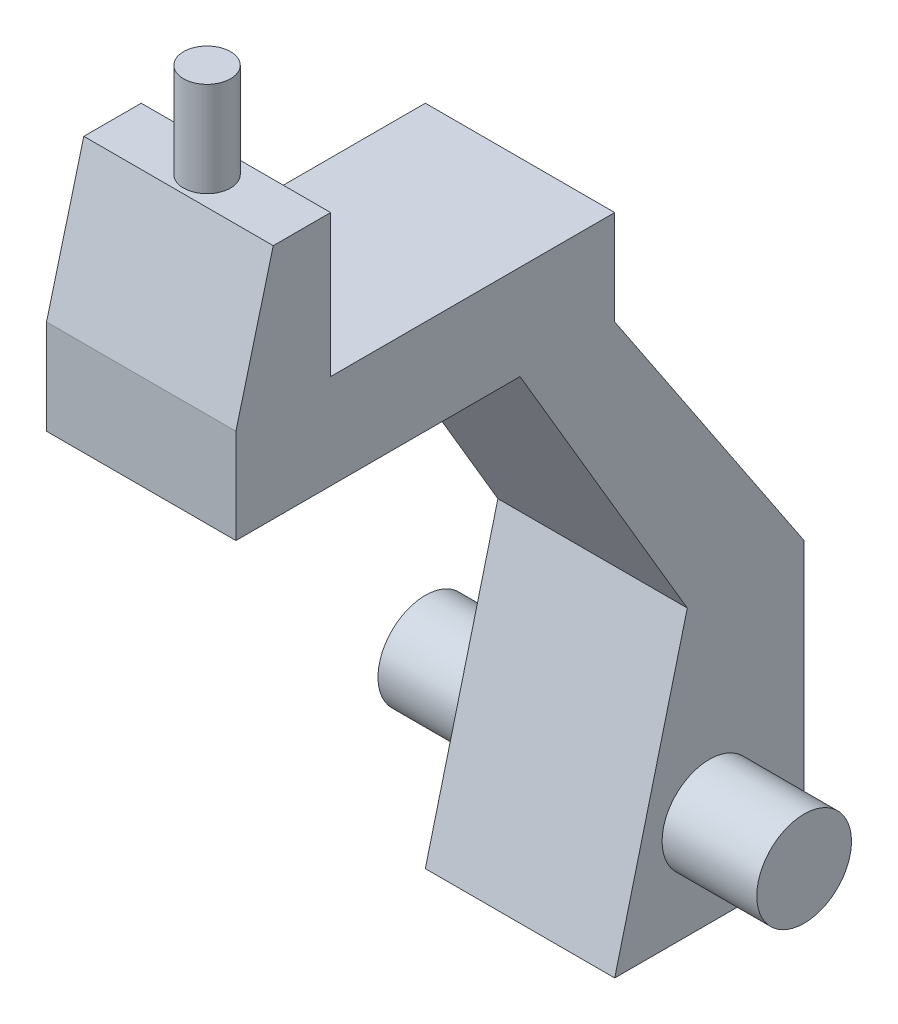
ISO-10303-21;
HEADER;
FILE_DESCRIPTION(('STEP AP214'),'2;1');
FILE_NAME('part.step','',(''),(''),'','','');
FILE_SCHEMA(('AUTOMOTIVE_DESIGN { 1 0 10303 214 1 1 1 1 }'));
ENDSEC;
DATA;
#1=APPLICATION_CONTEXT('core data for automotive mechanical design processes');
#2=APPLICATION_PROTOCOL_DEFINITION('international standard','automotive_design',2000,#1);
#3=PRODUCT_CONTEXT('',#1,'mechanical');
#4=PRODUCT('Part','Part','',(#3));
#5=PRODUCT_RELATED_PRODUCT_CATEGORY('part','',(#4));
#6=PRODUCT_DEFINITION_FORMATION('','',#4);
#7=PRODUCT_DEFINITION_CONTEXT('part definition',#1,'design');
#8=PRODUCT_DEFINITION('design','',#6,#7);
#9=PRODUCT_DEFINITION_SHAPE('','',#8);
#10=(LENGTH_UNIT() NAMED_UNIT(*) SI_UNIT(.MILLI.,.METRE.));
#11=(NAMED_UNIT(*) PLANE_ANGLE_UNIT() SI_UNIT($,.RADIAN.));
#12=(NAMED_UNIT(*) SI_UNIT($,.STERADIAN.) SOLID_ANGLE_UNIT());
#13=UNCERTAINTY_MEASURE_WITH_UNIT(LENGTH_MEASURE(1.E-05),#10,'distance_accuracy_value','');
#14=(GEOMETRIC_REPRESENTATION_CONTEXT(3) GLOBAL_UNCERTAINTY_ASSIGNED_CONTEXT((#13)) GLOBAL_UNIT_ASSIGNED_CONTEXT((#10,
#11,#12)) REPRESENTATION_CONTEXT('',''));
#15=CARTESIAN_POINT('',(0.,0.,0.));
#16=DIRECTION('',(0.,0.,1.));
#17=DIRECTION('',(1.,0.,0.));
#18=AXIS2_PLACEMENT_3D('',#15,#16,#17);
#19=CARTESIAN_POINT('',(-8.11188811188812,30.,-8.46153846153846));
#20=DIRECTION('',(1.,0.,0.));
#21=DIRECTION('',(0.,0.,-1.));
#22=AXIS2_PLACEMENT_3D('',#19,#20,#21);
#23=PLANE('',#22);
#24=CARTESIAN_POINT('',(-8.11188811188812,10.,1.53846153846154));
#25=DIRECTION('',(1.,0.,0.));
#26=DIRECTION('',(0.,0.,-1.));
#27=AXIS2_PLACEMENT_3D('',#24,#25,#26);
#28=CIRCLE('',#27,5.);
#29=CARTESIAN_POINT('',(-8.11188811188812,10.,-3.46153846153846));
#30=VERTEX_POINT('',#29);
#31=EDGE_CURVE('E177',#30,#30,#28,.T.);
#32=ORIENTED_EDGE('',*,*,#31,.T.);
#33=EDGE_LOOP('',(#32));
#34=FACE_BOUND('',#33,.T.);
#35=DIRECTION('',(0.,-1.,0.));
#36=VECTOR('',#35,1.);
#37=CARTESIAN_POINT('',(-8.11188811188811,70.,51.5384615384615));
#38=LINE('',#37,#36);
#39=CARTESIAN_POINT('',(-8.11188811188812,70.,51.5384615384615));
#40=VERTEX_POINT('',#39);
#41=CARTESIAN_POINT('',(-8.11188811188811,60.,51.5384615384615));
#42=VERTEX_POINT('',#41);
#43=EDGE_CURVE('E139',#40,#42,#38,.T.);
#44=ORIENTED_EDGE('',*,*,#43,.F.);
#45=DIRECTION('',(0.,0.967192592501153,-0.25404426584928));
#46=VECTOR('',#45,1.);
#47=CARTESIAN_POINT('',(-8.11188811188812,70.,51.5384615384615));
#48=LINE('',#47,#46);
#49=CARTESIAN_POINT('',(-8.11188811188812,85.,47.5985389033172));
#50=VERTEX_POINT('',#49);
#51=EDGE_CURVE('E125',#40,#50,#48,.T.);
#52=ORIENTED_EDGE('',*,*,#51,.T.);
#53=DIRECTION('',(0.,0.,1.));
#54=VECTOR('',#53,1.);
#55=CARTESIAN_POINT('',(-8.11188811188811,85.,51.5384615384615));
#56=LINE('',#55,#54);
#57=CARTESIAN_POINT('',(-8.11188811188811,85.,41.5384615384615));
#58=VERTEX_POINT('',#57);
#59=EDGE_CURVE('E218',#58,#50,#56,.T.);
#60=ORIENTED_EDGE('',*,*,#59,.F.);
#61=DIRECTION('',(0.,-1.,0.));
#62=VECTOR('',#61,1.);
#63=CARTESIAN_POINT('',(-8.11188811188811,85.,41.5384615384615));
#64=LINE('',#63,#62);
#65=CARTESIAN_POINT('',(-8.11188811188811,70.,41.5384615384615));
#66=VERTEX_POINT('',#65);
#67=EDGE_CURVE('E220',#58,#66,#64,.T.);
#68=ORIENTED_EDGE('',*,*,#67,.T.);
#69=DIRECTION('',(0.,0.,1.));
#70=VECTOR('',#69,1.);
#71=CARTESIAN_POINT('',(-8.11188811188812,70.,11.5384615384615));
#72=LINE('',#71,#70);
#73=CARTESIAN_POINT('',(-8.11188811188812,70.,11.5384615384615));
#74=VERTEX_POINT('',#73);
#75=EDGE_CURVE('E228',#74,#66,#72,.T.);
#76=ORIENTED_EDGE('',*,*,#75,.F.);
#77=DIRECTION('',(0.,-1.,0.));
#78=VECTOR('',#77,1.);
#79=CARTESIAN_POINT('',(-8.11188811188812,70.,11.5384615384615));
#80=LINE('',#79,#78);
#81=CARTESIAN_POINT('',(-8.11188811188812,60.,11.5384615384615));
#82=VERTEX_POINT('',#81);
#83=EDGE_CURVE('E235',#74,#82,#80,.T.);
#84=ORIENTED_EDGE('',*,*,#83,.T.);
#85=DIRECTION('',(0.,-0.832050294337844,-0.554700196225229));
#86=VECTOR('',#85,1.);
#87=CARTESIAN_POINT('',(-8.11188811188812,60.,11.5384615384615));
#88=LINE('',#87,#86);
#89=CARTESIAN_POINT('',(-8.11188811188812,30.,-8.46153846153846));
#90=VERTEX_POINT('',#89);
#91=EDGE_CURVE('E149',#82,#90,#88,.T.);
#92=ORIENTED_EDGE('',*,*,#91,.T.);
#93=DIRECTION('',(0.,-1.,0.));
#94=VECTOR('',#93,1.);
#95=CARTESIAN_POINT('',(-8.11188811188812,30.,-8.46153846153846));
#96=LINE('',#95,#94);
#97=CARTESIAN_POINT('',(-8.11188811188812,0.,-8.46153846153846));
#98=VERTEX_POINT('',#97);
#99=EDGE_CURVE('E197',#90,#98,#96,.T.);
#100=ORIENTED_EDGE('',*,*,#99,.T.);
#101=DIRECTION('',(0.,0.,1.));
#102=VECTOR('',#101,1.);
#103=CARTESIAN_POINT('',(-8.11188811188812,0.,-8.46153846153846));
#104=LINE('',#103,#102);
#105=CARTESIAN_POINT('',(-8.11188811188812,0.,11.5384615384615));
#106=VERTEX_POINT('',#105);
#107=EDGE_CURVE('E186',#98,#106,#104,.T.);
#108=ORIENTED_EDGE('',*,*,#107,.T.);
#109=DIRECTION('',(0.,0.968893399844212,-0.247478442977007));
#110=VECTOR('',#109,1.);
#111=CARTESIAN_POINT('',(-8.11188811188812,0.,11.5384615384615));
#112=LINE('',#111,#110);
#113=CARTESIAN_POINT('',(-8.11188811188812,30.,3.87574725998263));
#114=VERTEX_POINT('',#113);
#115=EDGE_CURVE('E170',#106,#114,#112,.T.);
#116=ORIENTED_EDGE('',*,*,#115,.T.);
#117=DIRECTION('',(0.,0.861737624952623,0.507354181751773));
#118=VECTOR('',#117,1.);
#119=CARTESIAN_POINT('',(-8.11188811188812,30.,3.87574725998263));
#120=LINE('',#119,#118);
#121=CARTESIAN_POINT('',(-8.11188811188812,60.,21.5384615384615));
#122=VERTEX_POINT('',#121);
#123=EDGE_CURVE('E163',#114,#122,#120,.T.);
#124=ORIENTED_EDGE('',*,*,#123,.T.);
#125=DIRECTION('',(0.,0.,1.));
#126=VECTOR('',#125,1.);
#127=CARTESIAN_POINT('',(-8.11188811188812,60.,11.5384615384615));
#128=LINE('',#127,#126);
#129=EDGE_CURVE('E145',#122,#42,#128,.T.);
#130=ORIENTED_EDGE('',*,*,#129,.T.);
#131=EDGE_LOOP('',(#44,#52,#60,#68,#76,#84,#92,#100,#108,#116,#124,#130));
#132=FACE_BOUND('',#131,.T.);
#133=ADVANCED_FACE('F38',(#34,#132),#23,.F.);
#134=CARTESIAN_POINT('',(11.8881118881119,30.,-8.46153846153846));
#135=DIRECTION('',(-1.,0.,0.));
#136=DIRECTION('',(0.,0.,1.));
#137=AXIS2_PLACEMENT_3D('',#134,#135,#136);
#138=PLANE('',#137);
#139=CARTESIAN_POINT('',(11.8881118881119,10.,1.53846153846154));
#140=DIRECTION('',(-1.,0.,0.));
#141=DIRECTION('',(0.,0.,1.));
#142=AXIS2_PLACEMENT_3D('',#139,#140,#141);
#143=CIRCLE('',#142,5.);
#144=CARTESIAN_POINT('',(11.8881118881119,10.,6.53846153846154));
#145=VERTEX_POINT('',#144);
#146=EDGE_CURVE('E41',#145,#145,#143,.F.);
#147=ORIENTED_EDGE('',*,*,#146,.F.);
#148=EDGE_LOOP('',(#147));
#149=FACE_BOUND('',#148,.T.);
#150=DIRECTION('',(0.,0.,-1.));
#151=VECTOR('',#150,1.);
#152=CARTESIAN_POINT('',(11.8881118881119,85.,51.5384615384615));
#153=LINE('',#152,#151);
#154=CARTESIAN_POINT('',(11.8881118881119,85.,47.5985389033172));
#155=VERTEX_POINT('',#154);
#156=CARTESIAN_POINT('',(11.8881118881119,85.,41.5384615384615));
#157=VERTEX_POINT('',#156);
#158=EDGE_CURVE('E212',#155,#157,#153,.T.);
#159=ORIENTED_EDGE('',*,*,#158,.F.);
#160=DIRECTION('',(0.,0.967192592501153,-0.25404426584928));
#161=VECTOR('',#160,1.);
#162=CARTESIAN_POINT('',(11.8881118881119,70.,51.5384615384615));
#163=LINE('',#162,#161);
#164=CARTESIAN_POINT('',(11.8881118881119,70.,51.5384615384615));
#165=VERTEX_POINT('',#164);
#166=EDGE_CURVE('E53',#165,#155,#163,.T.);
#167=ORIENTED_EDGE('',*,*,#166,.F.);
#168=DIRECTION('',(0.,-1.,0.));
#169=VECTOR('',#168,1.);
#170=CARTESIAN_POINT('',(11.8881118881119,70.,51.5384615384615));
#171=LINE('',#170,#169);
#172=CARTESIAN_POINT('',(11.8881118881119,60.,51.5384615384615));
#173=VERTEX_POINT('',#172);
#174=EDGE_CURVE('E141',#165,#173,#171,.T.);
#175=ORIENTED_EDGE('',*,*,#174,.T.);
#176=DIRECTION('',(0.,0.,-1.));
#177=VECTOR('',#176,1.);
#178=CARTESIAN_POINT('',(11.8881118881119,60.,11.5384615384615));
#179=LINE('',#178,#177);
#180=CARTESIAN_POINT('',(11.8881118881119,60.,21.5384615384615));
#181=VERTEX_POINT('',#180);
#182=EDGE_CURVE('E231',#173,#181,#179,.T.);
#183=ORIENTED_EDGE('',*,*,#182,.T.);
#184=DIRECTION('',(0.,0.861737624952623,0.507354181751773));
#185=VECTOR('',#184,1.);
#186=CARTESIAN_POINT('',(11.8881118881119,30.,3.87574725998263));
#187=LINE('',#186,#185);
#188=CARTESIAN_POINT('',(11.8881118881119,30.,3.87574725998263));
#189=VERTEX_POINT('',#188);
#190=EDGE_CURVE('E160',#189,#181,#187,.T.);
#191=ORIENTED_EDGE('',*,*,#190,.F.);
#192=DIRECTION('',(0.,0.968893399844212,-0.247478442977007));
#193=VECTOR('',#192,1.);
#194=CARTESIAN_POINT('',(11.8881118881119,0.,11.5384615384615));
#195=LINE('',#194,#193);
#196=CARTESIAN_POINT('',(11.8881118881119,0.,11.5384615384615));
#197=VERTEX_POINT('',#196);
#198=EDGE_CURVE('E169',#197,#189,#195,.T.);
#199=ORIENTED_EDGE('',*,*,#198,.F.);
#200=DIRECTION('',(0.,0.,-1.));
#201=VECTOR('',#200,1.);
#202=CARTESIAN_POINT('',(11.8881118881119,0.,-8.46153846153846));
#203=LINE('',#202,#201);
#204=CARTESIAN_POINT('',(11.8881118881119,0.,-8.46153846153846));
#205=VERTEX_POINT('',#204);
#206=EDGE_CURVE('E191',#197,#205,#203,.T.);
#207=ORIENTED_EDGE('',*,*,#206,.T.);
#208=DIRECTION('',(0.,-1.,0.));
#209=VECTOR('',#208,1.);
#210=CARTESIAN_POINT('',(11.8881118881119,30.,-8.46153846153846));
#211=LINE('',#210,#209);
#212=CARTESIAN_POINT('',(11.8881118881119,30.,-8.46153846153846));
#213=VERTEX_POINT('',#212);
#214=EDGE_CURVE('E198',#213,#205,#211,.T.);
#215=ORIENTED_EDGE('',*,*,#214,.F.);
#216=DIRECTION('',(0.,-0.832050294337844,-0.554700196225229));
#217=VECTOR('',#216,1.);
#218=CARTESIAN_POINT('',(11.8881118881119,60.,11.5384615384615));
#219=LINE('',#218,#217);
#220=CARTESIAN_POINT('',(11.8881118881119,60.,11.5384615384615));
#221=VERTEX_POINT('',#220);
#222=EDGE_CURVE('E147',#221,#213,#219,.T.);
#223=ORIENTED_EDGE('',*,*,#222,.F.);
#224=DIRECTION('',(0.,-1.,0.));
#225=VECTOR('',#224,1.);
#226=CARTESIAN_POINT('',(11.8881118881119,70.,11.5384615384615));
#227=LINE('',#226,#225);
#228=CARTESIAN_POINT('',(11.8881118881119,70.,11.5384615384615));
#229=VERTEX_POINT('',#228);
#230=EDGE_CURVE('E151',#229,#221,#227,.T.);
#231=ORIENTED_EDGE('',*,*,#230,.F.);
#232=DIRECTION('',(0.,0.,-1.));
#233=VECTOR('',#232,1.);
#234=CARTESIAN_POINT('',(11.8881118881119,70.,11.5384615384615));
#235=LINE('',#234,#233);
#236=CARTESIAN_POINT('',(11.8881118881119,70.,41.5384615384615));
#237=VERTEX_POINT('',#236);
#238=EDGE_CURVE('E230',#237,#229,#235,.T.);
#239=ORIENTED_EDGE('',*,*,#238,.F.);
#240=DIRECTION('',(0.,-1.,0.));
#241=VECTOR('',#240,1.);
#242=CARTESIAN_POINT('',(11.8881118881119,85.,41.5384615384615));
#243=LINE('',#242,#241);
#244=EDGE_CURVE('E214',#157,#237,#243,.T.);
#245=ORIENTED_EDGE('',*,*,#244,.F.);
#246=EDGE_LOOP('',(#159,#167,#175,#183,#191,#199,#207,#215,#223,#231,#239,#245));
#247=FACE_BOUND('',#246,.T.);
#248=ADVANCED_FACE('F206',(#149,#247),#138,.F.);
#249=CARTESIAN_POINT('',(-8.11188811188812,30.,-8.46153846153846));
#250=DIRECTION('',(0.,0.,1.));
#251=DIRECTION('',(1.,0.,0.));
#252=AXIS2_PLACEMENT_3D('',#249,#250,#251);
#253=PLANE('',#252);
#254=ORIENTED_EDGE('',*,*,#99,.F.);
#255=DIRECTION('',(1.,0.,0.));
#256=VECTOR('',#255,1.);
#257=CARTESIAN_POINT('',(-8.11188811188812,30.,-8.46153846153846));
#258=LINE('',#257,#256);
#259=EDGE_CURVE('E156',#90,#213,#258,.T.);
#260=ORIENTED_EDGE('',*,*,#259,.T.);
#261=ORIENTED_EDGE('',*,*,#214,.T.);
#262=DIRECTION('',(-1.,0.,0.));
#263=VECTOR('',#262,1.);
#264=CARTESIAN_POINT('',(-8.11188811188812,0.,-8.46153846153846));
#265=LINE('',#264,#263);
#266=EDGE_CURVE('E194',#205,#98,#265,.T.);
#267=ORIENTED_EDGE('',*,*,#266,.T.);
#268=EDGE_LOOP('',(#254,#260,#261,#267));
#269=FACE_BOUND('',#268,.T.);
#270=ADVANCED_FACE('F209',(#269),#253,.F.);
#271=CARTESIAN_POINT('',(0.,0.,0.));
#272=DIRECTION('',(0.,1.,0.));
#273=DIRECTION('',(0.,0.,1.));
#274=AXIS2_PLACEMENT_3D('',#271,#272,#273);
#275=PLANE('',#274);
#276=ORIENTED_EDGE('',*,*,#107,.F.);
#277=ORIENTED_EDGE('',*,*,#266,.F.);
#278=ORIENTED_EDGE('',*,*,#206,.F.);
#279=DIRECTION('',(1.,0.,0.));
#280=VECTOR('',#279,1.);
#281=CARTESIAN_POINT('',(-8.11188811188812,0.,11.5384615384615));
#282=LINE('',#281,#280);
#283=EDGE_CURVE('E189',#106,#197,#282,.T.);
#284=ORIENTED_EDGE('',*,*,#283,.F.);
#285=EDGE_LOOP('',(#276,#277,#278,#284));
#286=FACE_BOUND('',#285,.T.);
#287=ADVANCED_FACE('F309',(#286),#275,.F.);
#288=CARTESIAN_POINT('',(21.8881118881119,10.,1.53846153846154));
#289=DIRECTION('',(-1.,0.,0.));
#290=DIRECTION('',(0.,0.,1.));
#291=AXIS2_PLACEMENT_3D('',#288,#289,#290);
#292=CYLINDRICAL_SURFACE('',#291,5.);
#293=CARTESIAN_POINT('',(21.8881118881119,10.,1.53846153846154));
#294=DIRECTION('',(1.,0.,0.));
#295=DIRECTION('',(0.,0.,-1.));
#296=AXIS2_PLACEMENT_3D('',#293,#294,#295);
#297=CIRCLE('',#296,5.);
#298=CARTESIAN_POINT('',(21.8881118881119,10.,-3.46153846153846));
#299=VERTEX_POINT('',#298);
#300=EDGE_CURVE('E181',#299,#299,#297,.T.);
#301=ORIENTED_EDGE('',*,*,#300,.F.);
#302=EDGE_LOOP('',(#301));
#303=FACE_BOUND('',#302,.T.);
#304=ORIENTED_EDGE('',*,*,#146,.T.);
#305=EDGE_LOOP('',(#304));
#306=FACE_BOUND('',#305,.T.);
#307=ADVANCED_FACE('F204',(#303,#306),#292,.T.);
#308=CARTESIAN_POINT('',(21.8881118881119,10.,1.53846153846154));
#309=DIRECTION('',(1.,0.,0.));
#310=DIRECTION('',(0.,0.,-1.));
#311=AXIS2_PLACEMENT_3D('',#308,#309,#310);
#312=PLANE('',#311);
#313=ORIENTED_EDGE('',*,*,#300,.T.);
#314=EDGE_LOOP('',(#313));
#315=FACE_BOUND('',#314,.T.);
#316=ADVANCED_FACE('F293',(#315),#312,.T.);
#317=CARTESIAN_POINT('',(-18.1118881118881,10.,1.53846153846154));
#318=DIRECTION('',(1.,0.,0.));
#319=DIRECTION('',(0.,0.,-1.));
#320=AXIS2_PLACEMENT_3D('',#317,#318,#319);
#321=CYLINDRICAL_SURFACE('',#320,5.);
#322=CARTESIAN_POINT('',(-18.1118881118881,10.,1.53846153846154));
#323=DIRECTION('',(1.,0.,0.));
#324=DIRECTION('',(0.,0.,-1.));
#325=AXIS2_PLACEMENT_3D('',#322,#323,#324);
#326=CIRCLE('',#325,5.);
#327=CARTESIAN_POINT('',(-18.1118881118881,10.,-3.46153846153846));
#328=VERTEX_POINT('',#327);
#329=EDGE_CURVE('E178',#328,#328,#326,.T.);
#330=ORIENTED_EDGE('',*,*,#329,.T.);
#331=EDGE_LOOP('',(#330));
#332=FACE_BOUND('',#331,.T.);
#333=ORIENTED_EDGE('',*,*,#31,.F.);
#334=EDGE_LOOP('',(#333));
#335=FACE_BOUND('',#334,.T.);
#336=ADVANCED_FACE('F290',(#332,#335),#321,.T.);
#337=CARTESIAN_POINT('',(-18.1118881118881,10.,1.53846153846154));
#338=DIRECTION('',(-1.,0.,0.));
#339=DIRECTION('',(0.,0.,-1.));
#340=AXIS2_PLACEMENT_3D('',#337,#338,#339);
#341=PLANE('',#340);
#342=ORIENTED_EDGE('',*,*,#329,.F.);
#343=EDGE_LOOP('',(#342));
#344=FACE_BOUND('',#343,.T.);
#345=ADVANCED_FACE('F292',(#344),#341,.T.);
#346=CARTESIAN_POINT('',(-8.11188811188812,0.,11.5384615384615));
#347=DIRECTION('',(0.,-0.247478442977007,-0.968893399844212));
#348=DIRECTION('',(0.,0.968893399844212,-0.247478442977007));
#349=AXIS2_PLACEMENT_3D('',#346,#347,#348);
#350=PLANE('',#349);
#351=ORIENTED_EDGE('',*,*,#198,.T.);
#352=DIRECTION('',(1.,0.,0.));
#353=VECTOR('',#352,1.);
#354=CARTESIAN_POINT('',(-8.11188811188812,30.,3.87574725998263));
#355=LINE('',#354,#353);
#356=EDGE_CURVE('E173',#114,#189,#355,.T.);
#357=ORIENTED_EDGE('',*,*,#356,.F.);
#358=ORIENTED_EDGE('',*,*,#115,.F.);
#359=ORIENTED_EDGE('',*,*,#283,.T.);
#360=EDGE_LOOP('',(#351,#357,#358,#359));
#361=FACE_BOUND('',#360,.T.);
#362=ADVANCED_FACE('F300',(#361),#350,.F.);
#363=CARTESIAN_POINT('',(-8.11188811188812,30.,3.87574725998263));
#364=DIRECTION('',(0.,0.507354181751773,-0.861737624952623));
#365=DIRECTION('',(0.,0.861737624952624,0.507354181751774));
#366=AXIS2_PLACEMENT_3D('',#363,#364,#365);
#367=PLANE('',#366);
#368=ORIENTED_EDGE('',*,*,#190,.T.);
#369=DIRECTION('',(1.,0.,0.));
#370=VECTOR('',#369,1.);
#371=CARTESIAN_POINT('',(-8.11188811188812,60.,21.5384615384615));
#372=LINE('',#371,#370);
#373=EDGE_CURVE('E165',#122,#181,#372,.T.);
#374=ORIENTED_EDGE('',*,*,#373,.F.);
#375=ORIENTED_EDGE('',*,*,#123,.F.);
#376=ORIENTED_EDGE('',*,*,#356,.T.);
#377=EDGE_LOOP('',(#368,#374,#375,#376));
#378=FACE_BOUND('',#377,.T.);
#379=ADVANCED_FACE('F350',(#378),#367,.F.);
#380=CARTESIAN_POINT('',(-8.11188811188812,60.,11.5384615384615));
#381=DIRECTION('',(0.,-0.554700196225229,0.832050294337844));
#382=DIRECTION('',(0.,-0.832050294337844,-0.554700196225229));
#383=AXIS2_PLACEMENT_3D('',#380,#381,#382);
#384=PLANE('',#383);
#385=ORIENTED_EDGE('',*,*,#222,.T.);
#386=ORIENTED_EDGE('',*,*,#259,.F.);
#387=ORIENTED_EDGE('',*,*,#91,.F.);
#388=DIRECTION('',(1.,0.,0.));
#389=VECTOR('',#388,1.);
#390=CARTESIAN_POINT('',(-8.11188811188812,60.,11.5384615384615));
#391=LINE('',#390,#389);
#392=EDGE_CURVE('E158',#82,#221,#391,.T.);
#393=ORIENTED_EDGE('',*,*,#392,.T.);
#394=EDGE_LOOP('',(#385,#386,#387,#393));
#395=FACE_BOUND('',#394,.T.);
#396=ADVANCED_FACE('F251',(#395),#384,.F.);
#397=CARTESIAN_POINT('',(0.,60.,0.));
#398=DIRECTION('',(0.,1.,0.));
#399=DIRECTION('',(0.,0.,1.));
#400=AXIS2_PLACEMENT_3D('',#397,#398,#399);
#401=PLANE('',#400);
#402=ORIENTED_EDGE('',*,*,#129,.F.);
#403=ORIENTED_EDGE('',*,*,#373,.T.);
#404=ORIENTED_EDGE('',*,*,#182,.F.);
#405=DIRECTION('',(1.,0.,0.));
#406=VECTOR('',#405,1.);
#407=CARTESIAN_POINT('',(-8.11188811188811,60.,51.5384615384615));
#408=LINE('',#407,#406);
#409=EDGE_CURVE('E237',#42,#173,#408,.T.);
#410=ORIENTED_EDGE('',*,*,#409,.F.);
#411=EDGE_LOOP('',(#402,#403,#404,#410));
#412=FACE_BOUND('',#411,.T.);
#413=ADVANCED_FACE('F363',(#412),#401,.F.);
#414=CARTESIAN_POINT('',(-8.11188811188811,70.,51.5384615384615));
#415=DIRECTION('',(0.,0.,-1.));
#416=DIRECTION('',(-1.,0.,0.));
#417=AXIS2_PLACEMENT_3D('',#414,#415,#416);
#418=PLANE('',#417);
#419=ORIENTED_EDGE('',*,*,#174,.F.);
#420=DIRECTION('',(1.,0.,0.));
#421=VECTOR('',#420,1.);
#422=CARTESIAN_POINT('',(-8.11188811188812,70.,51.5384615384615));
#423=LINE('',#422,#421);
#424=EDGE_CURVE('E128',#40,#165,#423,.T.);
#425=ORIENTED_EDGE('',*,*,#424,.F.);
#426=ORIENTED_EDGE('',*,*,#43,.T.);
#427=ORIENTED_EDGE('',*,*,#409,.T.);
#428=EDGE_LOOP('',(#419,#425,#426,#427));
#429=FACE_BOUND('',#428,.T.);
#430=ADVANCED_FACE('F137',(#429),#418,.F.);
#431=CARTESIAN_POINT('',(-8.11188811188812,70.,11.5384615384615));
#432=DIRECTION('',(0.,0.,1.));
#433=DIRECTION('',(1.,0.,0.));
#434=AXIS2_PLACEMENT_3D('',#431,#432,#433);
#435=PLANE('',#434);
#436=ORIENTED_EDGE('',*,*,#392,.F.);
#437=ORIENTED_EDGE('',*,*,#83,.F.);
#438=DIRECTION('',(-1.,0.,0.));
#439=VECTOR('',#438,1.);
#440=CARTESIAN_POINT('',(-8.11188811188812,70.,11.5384615384615));
#441=LINE('',#440,#439);
#442=EDGE_CURVE('E233',#229,#74,#441,.T.);
#443=ORIENTED_EDGE('',*,*,#442,.F.);
#444=ORIENTED_EDGE('',*,*,#230,.T.);
#445=EDGE_LOOP('',(#436,#437,#443,#444));
#446=FACE_BOUND('',#445,.T.);
#447=ADVANCED_FACE('F247',(#446),#435,.F.);
#448=CARTESIAN_POINT('',(0.,70.,0.));
#449=DIRECTION('',(0.,1.,0.));
#450=DIRECTION('',(0.,0.,1.));
#451=AXIS2_PLACEMENT_3D('',#448,#449,#450);
#452=PLANE('',#451);
#453=DIRECTION('',(-1.,0.,0.));
#454=VECTOR('',#453,1.);
#455=CARTESIAN_POINT('',(-8.11188811188811,70.,41.5384615384615));
#456=LINE('',#455,#454);
#457=EDGE_CURVE('E61',#237,#66,#456,.T.);
#458=ORIENTED_EDGE('',*,*,#457,.F.);
#459=ORIENTED_EDGE('',*,*,#238,.T.);
#460=ORIENTED_EDGE('',*,*,#442,.T.);
#461=ORIENTED_EDGE('',*,*,#75,.T.);
#462=EDGE_LOOP('',(#458,#459,#460,#461));
#463=FACE_BOUND('',#462,.T.);
#464=ADVANCED_FACE('F257',(#463),#452,.T.);
#465=CARTESIAN_POINT('',(-8.11188811188811,85.,41.5384615384615));
#466=DIRECTION('',(0.,0.,1.));
#467=DIRECTION('',(1.,0.,0.));
#468=AXIS2_PLACEMENT_3D('',#465,#466,#467);
#469=PLANE('',#468);
#470=ORIENTED_EDGE('',*,*,#457,.T.);
#471=ORIENTED_EDGE('',*,*,#67,.F.);
#472=DIRECTION('',(-1.,0.,0.));
#473=VECTOR('',#472,1.);
#474=CARTESIAN_POINT('',(-8.11188811188811,85.,41.5384615384615));
#475=LINE('',#474,#473);
#476=EDGE_CURVE('E217',#157,#58,#475,.T.);
#477=ORIENTED_EDGE('',*,*,#476,.F.);
#478=ORIENTED_EDGE('',*,*,#244,.T.);
#479=EDGE_LOOP('',(#470,#471,#477,#478));
#480=FACE_BOUND('',#479,.T.);
#481=ADVANCED_FACE('F259',(#480),#469,.F.);
#482=CARTESIAN_POINT('',(0.,85.,0.));
#483=DIRECTION('',(0.,-1.,0.));
#484=DIRECTION('',(0.,0.,-1.));
#485=AXIS2_PLACEMENT_3D('',#482,#483,#484);
#486=PLANE('',#485);
#487=CARTESIAN_POINT('',(1.88811188811188,85.,44.5884615384615));
#488=DIRECTION('',(0.,1.,0.));
#489=DIRECTION('',(0.,0.,1.));
#490=AXIS2_PLACEMENT_3D('',#487,#488,#489);
#491=CIRCLE('',#490,2.48164305879814);
#492=CARTESIAN_POINT('',(1.88811188811188,85.,47.0701045972597));
#493=VERTEX_POINT('',#492);
#494=EDGE_CURVE('E11',#493,#493,#491,.T.);
#495=ORIENTED_EDGE('',*,*,#494,.F.);
#496=EDGE_LOOP('',(#495));
#497=FACE_BOUND('',#496,.T.);
#498=ORIENTED_EDGE('',*,*,#59,.T.);
#499=DIRECTION('',(1.,0.,0.));
#500=VECTOR('',#499,1.);
#501=CARTESIAN_POINT('',(-8.11188811188812,85.,47.5985389033172));
#502=LINE('',#501,#500);
#503=EDGE_CURVE('E129',#50,#155,#502,.T.);
#504=ORIENTED_EDGE('',*,*,#503,.T.);
#505=ORIENTED_EDGE('',*,*,#158,.T.);
#506=ORIENTED_EDGE('',*,*,#476,.T.);
#507=EDGE_LOOP('',(#498,#504,#505,#506));
#508=FACE_BOUND('',#507,.T.);
#509=ADVANCED_FACE('F260',(#497,#508),#486,.F.);
#510=CARTESIAN_POINT('',(-8.11188811188812,70.,51.5384615384615));
#511=DIRECTION('',(0.,-0.25404426584928,-0.967192592501153));
#512=DIRECTION('',(0.,0.967192592501153,-0.25404426584928));
#513=AXIS2_PLACEMENT_3D('',#510,#511,#512);
#514=PLANE('',#513);
#515=ORIENTED_EDGE('',*,*,#166,.T.);
#516=ORIENTED_EDGE('',*,*,#503,.F.);
#517=ORIENTED_EDGE('',*,*,#51,.F.);
#518=ORIENTED_EDGE('',*,*,#424,.T.);
#519=EDGE_LOOP('',(#515,#516,#517,#518));
#520=FACE_BOUND('',#519,.T.);
#521=ADVANCED_FACE('F127',(#520),#514,.F.);
#522=CARTESIAN_POINT('',(1.88811188811188,95.,44.5884615384615));
#523=DIRECTION('',(0.,-1.,0.));
#524=DIRECTION('',(0.,0.,-1.));
#525=AXIS2_PLACEMENT_3D('',#522,#523,#524);
#526=CYLINDRICAL_SURFACE('',#525,2.48164305879814);
#527=CARTESIAN_POINT('',(1.88811188811188,95.,44.5884615384615));
#528=DIRECTION('',(0.,1.,0.));
#529=DIRECTION('',(0.,0.,1.));
#530=AXIS2_PLACEMENT_3D('',#527,#528,#529);
#531=CIRCLE('',#530,2.48164305879814);
#532=CARTESIAN_POINT('',(1.88811188811188,95.,47.0701045972597));
#533=VERTEX_POINT('',#532);
#534=EDGE_CURVE('E263',#533,#533,#531,.T.);
#535=ORIENTED_EDGE('',*,*,#534,.F.);
#536=EDGE_LOOP('',(#535));
#537=FACE_BOUND('',#536,.T.);
#538=ORIENTED_EDGE('',*,*,#494,.T.);
#539=EDGE_LOOP('',(#538));
#540=FACE_BOUND('',#539,.T.);
#541=ADVANCED_FACE('F270',(#537,#540),#526,.T.);
#542=CARTESIAN_POINT('',(1.88811188811188,95.,44.5884615384615));
#543=DIRECTION('',(0.,1.,0.));
#544=DIRECTION('',(0.,0.,1.));
#545=AXIS2_PLACEMENT_3D('',#542,#543,#544);
#546=PLANE('',#545);
#547=ORIENTED_EDGE('',*,*,#534,.T.);
#548=EDGE_LOOP('',(#547));
#549=FACE_BOUND('',#548,.T.);
#550=ADVANCED_FACE('F268',(#549),#546,.T.);
#551=CLOSED_SHELL('',(#133,#248,#270,#287,#307,#316,#336,#345,#362,#379,#396,#413,#430,#447,
#464,#481,#509,#521,#541,#550));
#552=MANIFOLD_SOLID_BREP('B2',#551);
#553=ADVANCED_BREP_SHAPE_REPRESENTATION('',(#18,#552),#14);
#554=SHAPE_DEFINITION_REPRESENTATION(#9,#553);
ENDSEC;
END-ISO-10303-21;
